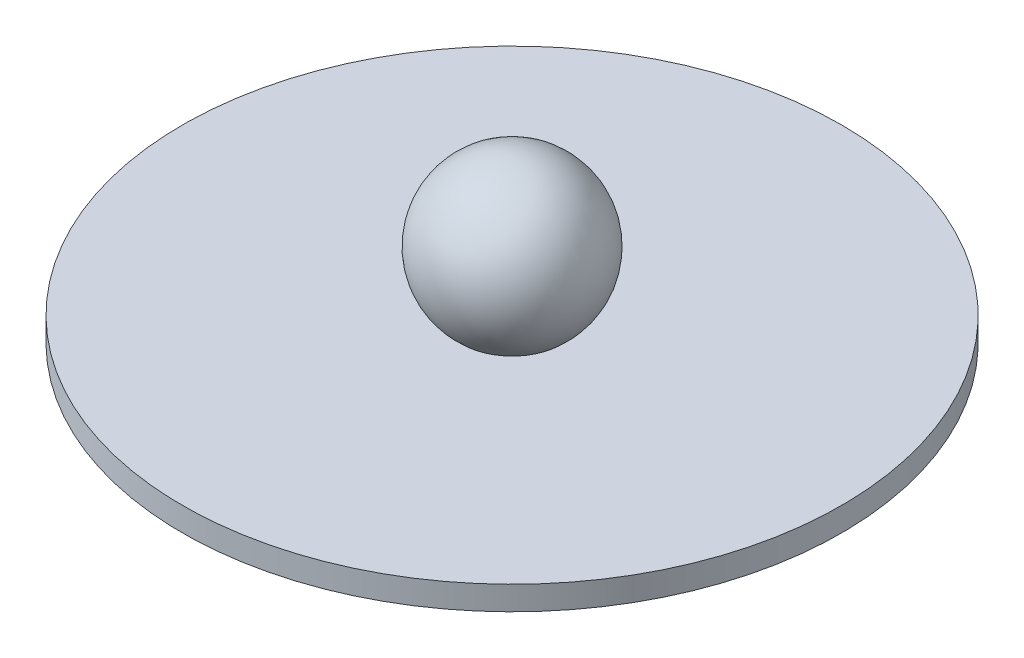
ISO-10303-21;
HEADER;
FILE_DESCRIPTION(('STEP AP214'),'2;1');
FILE_NAME('part.step','',(''),(''),'','','');
FILE_SCHEMA(('AUTOMOTIVE_DESIGN { 1 0 10303 214 1 1 1 1 }'));
ENDSEC;
DATA;
#1=APPLICATION_CONTEXT('core data for automotive mechanical design processes');
#2=APPLICATION_PROTOCOL_DEFINITION('international standard','automotive_design',2000,#1);
#3=PRODUCT_CONTEXT('',#1,'mechanical');
#4=PRODUCT('Part','Part','',(#3));
#5=PRODUCT_RELATED_PRODUCT_CATEGORY('part','',(#4));
#6=PRODUCT_DEFINITION_FORMATION('','',#4);
#7=PRODUCT_DEFINITION_CONTEXT('part definition',#1,'design');
#8=PRODUCT_DEFINITION('design','',#6,#7);
#9=PRODUCT_DEFINITION_SHAPE('','',#8);
#10=(LENGTH_UNIT() NAMED_UNIT(*) SI_UNIT(.MILLI.,.METRE.));
#11=(NAMED_UNIT(*) PLANE_ANGLE_UNIT() SI_UNIT($,.RADIAN.));
#12=(NAMED_UNIT(*) SI_UNIT($,.STERADIAN.) SOLID_ANGLE_UNIT());
#13=UNCERTAINTY_MEASURE_WITH_UNIT(LENGTH_MEASURE(1.E-05),#10,'distance_accuracy_value','');
#14=(GEOMETRIC_REPRESENTATION_CONTEXT(3) GLOBAL_UNCERTAINTY_ASSIGNED_CONTEXT((#13)) GLOBAL_UNIT_ASSIGNED_CONTEXT((#10,
#11,#12)) REPRESENTATION_CONTEXT('',''));
#15=CARTESIAN_POINT('',(0.,0.,0.));
#16=DIRECTION('',(0.,0.,1.));
#17=DIRECTION('',(1.,0.,0.));
#18=AXIS2_PLACEMENT_3D('',#15,#16,#17);
#19=CARTESIAN_POINT('',(0.,12.7,0.));
#20=DIRECTION('',(0.,1.,0.));
#21=DIRECTION('',(0.,0.,1.));
#22=AXIS2_PLACEMENT_3D('',#19,#20,#21);
#23=PLANE('',#22);
#24=CARTESIAN_POINT('',(0.,12.7,0.));
#25=DIRECTION('',(0.,1.,0.));
#26=DIRECTION('',(0.,0.,1.));
#27=AXIS2_PLACEMENT_3D('',#24,#25,#26);
#28=CIRCLE('',#27,12.2794054520389);
#29=CARTESIAN_POINT('',(0.,12.7,12.2794054520389));
#30=VERTEX_POINT('',#29);
#31=EDGE_CURVE('E10',#30,#30,#28,.T.);
#32=ORIENTED_EDGE('',*,*,#31,.F.);
#33=EDGE_LOOP('',(#32));
#34=FACE_BOUND('',#33,.T.);
#35=CARTESIAN_POINT('',(0.,12.7,0.));
#36=DIRECTION('',(0.,-1.,0.));
#37=DIRECTION('',(0.,0.,-1.));
#38=AXIS2_PLACEMENT_3D('',#35,#36,#37);
#39=CIRCLE('',#38,80.645);
#40=CARTESIAN_POINT('',(0.,12.7,-80.645));
#41=VERTEX_POINT('',#40);
#42=EDGE_CURVE('E39',#41,#41,#39,.T.);
#43=ORIENTED_EDGE('',*,*,#42,.F.);
#44=EDGE_LOOP('',(#43));
#45=FACE_BOUND('',#44,.T.);
#46=ADVANCED_FACE('F33',(#34,#45),#23,.T.);
#47=CARTESIAN_POINT('',(0.,0.,0.));
#48=DIRECTION('',(0.,-1.,0.));
#49=DIRECTION('',(0.,0.,-1.));
#50=AXIS2_PLACEMENT_3D('',#47,#48,#49);
#51=CYLINDRICAL_SURFACE('',#50,80.645);
#52=ORIENTED_EDGE('',*,*,#42,.T.);
#53=EDGE_LOOP('',(#52));
#54=FACE_BOUND('',#53,.T.);
#55=CARTESIAN_POINT('',(0.,6.85799999999999,0.));
#56=DIRECTION('',(0.,-1.,0.));
#57=DIRECTION('',(0.,0.,-1.));
#58=AXIS2_PLACEMENT_3D('',#55,#56,#57);
#59=CIRCLE('',#58,80.645);
#60=CARTESIAN_POINT('',(0.,6.85799999999999,-80.645));
#61=VERTEX_POINT('',#60);
#62=EDGE_CURVE('E43',#61,#61,#59,.T.);
#63=ORIENTED_EDGE('',*,*,#62,.F.);
#64=EDGE_LOOP('',(#63));
#65=FACE_BOUND('',#64,.T.);
#66=ADVANCED_FACE('F69',(#54,#65),#51,.T.);
#67=CARTESIAN_POINT('',(80.645,6.85799999999999,0.));
#68=DIRECTION('',(0.,-1.,0.));
#69=DIRECTION('',(0.,0.,-1.));
#70=AXIS2_PLACEMENT_3D('',#67,#68,#69);
#71=PLANE('',#70);
#72=ORIENTED_EDGE('',*,*,#62,.T.);
#73=EDGE_LOOP('',(#72));
#74=FACE_BOUND('',#73,.T.);
#75=CARTESIAN_POINT('',(0.,6.85799999999999,0.));
#76=DIRECTION('',(0.,-1.,0.));
#77=DIRECTION('',(0.,0.,-1.));
#78=AXIS2_PLACEMENT_3D('',#75,#76,#77);
#79=CIRCLE('',#78,75.565);
#80=CARTESIAN_POINT('',(0.,6.85799999999999,-75.565));
#81=VERTEX_POINT('',#80);
#82=EDGE_CURVE('E47',#81,#81,#79,.T.);
#83=ORIENTED_EDGE('',*,*,#82,.F.);
#84=EDGE_LOOP('',(#83));
#85=FACE_BOUND('',#84,.T.);
#86=ADVANCED_FACE('F60',(#74,#85),#71,.T.);
#87=CARTESIAN_POINT('',(0.,0.,0.));
#88=DIRECTION('',(0.,1.,0.));
#89=DIRECTION('',(0.,0.,1.));
#90=AXIS2_PLACEMENT_3D('',#87,#88,#89);
#91=CONICAL_SURFACE('',#90,68.7070000000001,0.785398163397443);
#92=ORIENTED_EDGE('',*,*,#82,.T.);
#93=EDGE_LOOP('',(#92));
#94=FACE_BOUND('',#93,.T.);
#95=CARTESIAN_POINT('',(0.,0.,0.));
#96=DIRECTION('',(0.,-1.,0.));
#97=DIRECTION('',(0.,0.,-1.));
#98=AXIS2_PLACEMENT_3D('',#95,#96,#97);
#99=CIRCLE('',#98,68.7070000000001);
#100=CARTESIAN_POINT('',(0.,0.,-68.7070000000001));
#101=VERTEX_POINT('',#100);
#102=EDGE_CURVE('E52',#101,#101,#99,.T.);
#103=ORIENTED_EDGE('',*,*,#102,.F.);
#104=EDGE_LOOP('',(#103));
#105=FACE_BOUND('',#104,.T.);
#106=ADVANCED_FACE('F58',(#94,#105),#91,.T.);
#107=CARTESIAN_POINT('',(68.7070000000001,0.,0.));
#108=DIRECTION('',(0.,-1.,0.));
#109=DIRECTION('',(0.,0.,-1.));
#110=AXIS2_PLACEMENT_3D('',#107,#108,#109);
#111=PLANE('',#110);
#112=ORIENTED_EDGE('',*,*,#102,.T.);
#113=EDGE_LOOP('',(#112));
#114=FACE_BOUND('',#113,.T.);
#115=ADVANCED_FACE('F56',(#114),#111,.T.);
#116=CARTESIAN_POINT('',(0.,27.264295442775,0.));
#117=DIRECTION('',(0.,-1.,0.));
#118=DIRECTION('',(-1.,0.,0.));
#119=AXIS2_PLACEMENT_3D('',#116,#117,#118);
#120=SPHERICAL_SURFACE('',#119,19.05);
#121=ORIENTED_EDGE('',*,*,#31,.T.);
#122=EDGE_LOOP('',(#121));
#123=FACE_BOUND('',#122,.T.);
#124=ADVANCED_FACE('F67',(#123),#120,.T.);
#125=CLOSED_SHELL('',(#46,#66,#86,#106,#115,#124));
#126=MANIFOLD_SOLID_BREP('B2',#125);
#127=ADVANCED_BREP_SHAPE_REPRESENTATION('',(#18,#126),#14);
#128=SHAPE_DEFINITION_REPRESENTATION(#9,#127);
ENDSEC;
END-ISO-10303-21;
